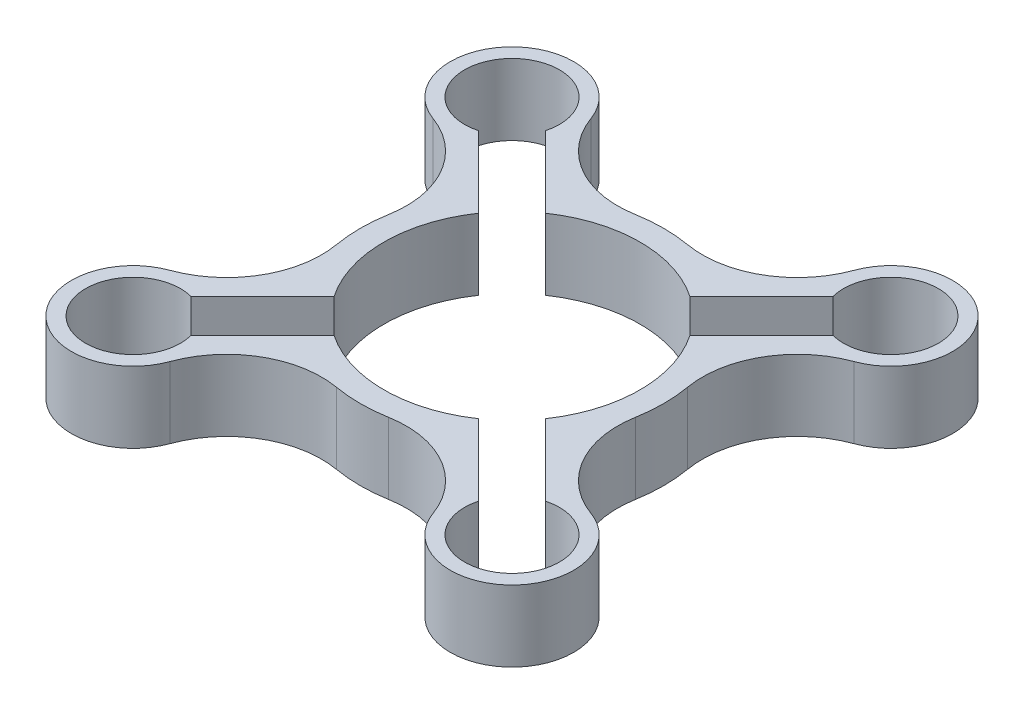
ISO-10303-21;
HEADER;
FILE_DESCRIPTION(('STEP AP214'),'2;1');
FILE_NAME('part.step','',(''),(''),'','','');
FILE_SCHEMA(('AUTOMOTIVE_DESIGN { 1 0 10303 214 1 1 1 1 }'));
ENDSEC;
DATA;
#1=APPLICATION_CONTEXT('core data for automotive mechanical design processes');
#2=APPLICATION_PROTOCOL_DEFINITION('international standard','automotive_design',2000,#1);
#3=PRODUCT_CONTEXT('',#1,'mechanical');
#4=PRODUCT('Part','Part','',(#3));
#5=PRODUCT_RELATED_PRODUCT_CATEGORY('part','',(#4));
#6=PRODUCT_DEFINITION_FORMATION('','',#4);
#7=PRODUCT_DEFINITION_CONTEXT('part definition',#1,'design');
#8=PRODUCT_DEFINITION('design','',#6,#7);
#9=PRODUCT_DEFINITION_SHAPE('','',#8);
#10=(LENGTH_UNIT() NAMED_UNIT(*) SI_UNIT(.MILLI.,.METRE.));
#11=(NAMED_UNIT(*) PLANE_ANGLE_UNIT() SI_UNIT($,.RADIAN.));
#12=(NAMED_UNIT(*) SI_UNIT($,.STERADIAN.) SOLID_ANGLE_UNIT());
#13=UNCERTAINTY_MEASURE_WITH_UNIT(LENGTH_MEASURE(1.E-05),#10,'distance_accuracy_value','');
#14=(GEOMETRIC_REPRESENTATION_CONTEXT(3) GLOBAL_UNCERTAINTY_ASSIGNED_CONTEXT((#13)) GLOBAL_UNIT_ASSIGNED_CONTEXT((#10,
#11,#12)) REPRESENTATION_CONTEXT('',''));
#15=CARTESIAN_POINT('',(0.,0.,0.));
#16=DIRECTION('',(0.,0.,1.));
#17=DIRECTION('',(1.,0.,0.));
#18=AXIS2_PLACEMENT_3D('',#15,#16,#17);
#19=CARTESIAN_POINT('',(0.,15.,0.));
#20=DIRECTION('',(0.,-1.,0.));
#21=DIRECTION('',(0.,0.,-1.));
#22=AXIS2_PLACEMENT_3D('',#19,#20,#21);
#23=CYLINDRICAL_SURFACE('',#22,27.);
#24=DIRECTION('',(0.,1.,0.));
#25=VECTOR('',#24,1.);
#26=CARTESIAN_POINT('',(22.2971969452275,0.,15.2261291333608));
#27=LINE('',#26,#25);
#28=CARTESIAN_POINT('',(22.2971969452275,0.,15.2261291333608));
#29=VERTEX_POINT('',#28);
#30=CARTESIAN_POINT('',(22.2971969452275,15.,15.2261291333608));
#31=VERTEX_POINT('',#30);
#32=EDGE_CURVE('E361',#29,#31,#27,.T.);
#33=ORIENTED_EDGE('',*,*,#32,.T.);
#34=CARTESIAN_POINT('',(0.,15.,0.));
#35=DIRECTION('',(0.,1.,0.));
#36=DIRECTION('',(0.,0.,1.));
#37=AXIS2_PLACEMENT_3D('',#34,#35,#36);
#38=CIRCLE('',#37,27.);
#39=CARTESIAN_POINT('',(22.2971969452264,15.,-15.226129133361));
#40=VERTEX_POINT('',#39);
#41=EDGE_CURVE('E414',#31,#40,#38,.T.);
#42=ORIENTED_EDGE('',*,*,#41,.T.);
#43=DIRECTION('',(0.,1.,0.));
#44=VECTOR('',#43,1.);
#45=CARTESIAN_POINT('',(22.2971969452264,0.,-15.226129133361));
#46=LINE('',#45,#44);
#47=CARTESIAN_POINT('',(22.2971969452264,0.,-15.226129133361));
#48=VERTEX_POINT('',#47);
#49=EDGE_CURVE('E268',#48,#40,#46,.T.);
#50=ORIENTED_EDGE('',*,*,#49,.F.);
#51=CARTESIAN_POINT('',(0.,0.,0.));
#52=DIRECTION('',(0.,1.,0.));
#53=DIRECTION('',(0.,0.,1.));
#54=AXIS2_PLACEMENT_3D('',#51,#52,#53);
#55=CIRCLE('',#54,27.);
#56=EDGE_CURVE('E284',#29,#48,#55,.T.);
#57=ORIENTED_EDGE('',*,*,#56,.F.);
#58=EDGE_LOOP('',(#33,#42,#50,#57));
#59=FACE_BOUND('',#58,.T.);
#60=ADVANCED_FACE('F46',(#59),#23,.F.);
#61=DIRECTION('',(0.,1.,0.));
#62=VECTOR('',#61,1.);
#63=CARTESIAN_POINT('',(15.2261291333619,0.,22.2971969452261));
#64=LINE('',#63,#62);
#65=CARTESIAN_POINT('',(15.2261291333617,0.,22.297196945226));
#66=VERTEX_POINT('',#65);
#67=CARTESIAN_POINT('',(15.2261291333619,15.,22.2971969452261));
#68=VERTEX_POINT('',#67);
#69=EDGE_CURVE('E372',#66,#68,#64,.T.);
#70=ORIENTED_EDGE('',*,*,#69,.F.);
#71=CARTESIAN_POINT('',(-15.226129133361,0.,22.2971969452265));
#72=VERTEX_POINT('',#71);
#73=EDGE_CURVE('E365',#72,#66,#55,.T.);
#74=ORIENTED_EDGE('',*,*,#73,.F.);
#75=DIRECTION('',(0.,1.,0.));
#76=VECTOR('',#75,1.);
#77=CARTESIAN_POINT('',(-15.226129133361,0.,22.2971969452265));
#78=LINE('',#77,#76);
#79=CARTESIAN_POINT('',(-15.226129133361,15.,22.2971969452265));
#80=VERTEX_POINT('',#79);
#81=EDGE_CURVE('E375',#72,#80,#78,.T.);
#82=ORIENTED_EDGE('',*,*,#81,.T.);
#83=EDGE_CURVE('E409',#80,#68,#38,.T.);
#84=ORIENTED_EDGE('',*,*,#83,.T.);
#85=EDGE_LOOP('',(#70,#74,#82,#84));
#86=FACE_BOUND('',#85,.T.);
#87=ADVANCED_FACE('F663',(#86),#23,.F.);
#88=DIRECTION('',(0.,1.,0.));
#89=VECTOR('',#88,1.);
#90=CARTESIAN_POINT('',(-22.2971969452261,0.,15.2261291333608));
#91=LINE('',#90,#89);
#92=CARTESIAN_POINT('',(-22.2971969452264,0.,15.226129133361));
#93=VERTEX_POINT('',#92);
#94=CARTESIAN_POINT('',(-22.2971969452261,15.,15.2261291333608));
#95=VERTEX_POINT('',#94);
#96=EDGE_CURVE('E385',#93,#95,#91,.T.);
#97=ORIENTED_EDGE('',*,*,#96,.F.);
#98=CARTESIAN_POINT('',(-22.2971969452263,0.,-15.2261291333599));
#99=VERTEX_POINT('',#98);
#100=EDGE_CURVE('E418',#99,#93,#55,.T.);
#101=ORIENTED_EDGE('',*,*,#100,.F.);
#102=DIRECTION('',(0.,1.,0.));
#103=VECTOR('',#102,1.);
#104=CARTESIAN_POINT('',(-22.2971969452263,0.,-15.2261291333599));
#105=LINE('',#104,#103);
#106=CARTESIAN_POINT('',(-22.2971969452263,15.,-15.2261291333599));
#107=VERTEX_POINT('',#106);
#108=EDGE_CURVE('E388',#99,#107,#105,.T.);
#109=ORIENTED_EDGE('',*,*,#108,.T.);
#110=EDGE_CURVE('E413',#107,#95,#38,.T.);
#111=ORIENTED_EDGE('',*,*,#110,.T.);
#112=EDGE_LOOP('',(#97,#101,#109,#111));
#113=FACE_BOUND('',#112,.T.);
#114=ADVANCED_FACE('F671',(#113),#23,.F.);
#115=CARTESIAN_POINT('',(24.4444242437382,15.,-45.5888706088684));
#116=DIRECTION('',(0.,1.,0.));
#117=DIRECTION('',(0.,0.,1.));
#118=AXIS2_PLACEMENT_3D('',#115,#116,#117);
#119=PLANE('',#118);
#120=DIRECTION('',(-0.707106781186548,0.,-0.707106781186547));
#121=VECTOR('',#120,1.);
#122=CARTESIAN_POINT('',(22.2971969452275,15.,15.2261291333608));
#123=LINE('',#122,#121);
#124=CARTESIAN_POINT('',(37.3633426860159,15.,30.2922748741495));
#125=VERTEX_POINT('',#124);
#126=EDGE_CURVE('E286',#125,#31,#123,.T.);
#127=ORIENTED_EDGE('',*,*,#126,.F.);
#128=CARTESIAN_POINT('',(39.9515331370399,15.,39.9515331370399));
#129=DIRECTION('',(0.,1.,0.));
#130=DIRECTION('',(0.,0.,1.));
#131=AXIS2_PLACEMENT_3D('',#128,#129,#130);
#132=CIRCLE('',#131,9.99999999999948);
#133=CARTESIAN_POINT('',(30.2922748741503,15.,37.3633426860145));
#134=VERTEX_POINT('',#133);
#135=EDGE_CURVE('E289',#134,#125,#132,.T.);
#136=ORIENTED_EDGE('',*,*,#135,.F.);
#137=DIRECTION('',(0.707106781186548,0.,0.707106781186547));
#138=VECTOR('',#137,1.);
#139=CARTESIAN_POINT('',(15.226129133362,15.,22.2971969452263));
#140=LINE('',#139,#138);
#141=EDGE_CURVE('E354',#68,#134,#140,.T.);
#142=ORIENTED_EDGE('',*,*,#141,.F.);
#143=ORIENTED_EDGE('',*,*,#83,.F.);
#144=DIRECTION('',(0.707106781186548,0.,-0.707106781186547));
#145=VECTOR('',#144,1.);
#146=CARTESIAN_POINT('',(-15.226129133361,15.,22.2971969452265));
#147=LINE('',#146,#145);
#148=CARTESIAN_POINT('',(-30.2922748741492,15.,37.3633426860147));
#149=VERTEX_POINT('',#148);
#150=EDGE_CURVE('E351',#149,#80,#147,.T.);
#151=ORIENTED_EDGE('',*,*,#150,.F.);
#152=CARTESIAN_POINT('',(-39.9515331370399,15.,39.9515331370399));
#153=DIRECTION('',(0.,1.,0.));
#154=DIRECTION('',(0.,0.,1.));
#155=AXIS2_PLACEMENT_3D('',#152,#153,#154);
#156=CIRCLE('',#155,10.);
#157=CARTESIAN_POINT('',(-37.3633426860147,15.,30.2922748741493));
#158=VERTEX_POINT('',#157);
#159=EDGE_CURVE('E347',#158,#149,#156,.T.);
#160=ORIENTED_EDGE('',*,*,#159,.F.);
#161=DIRECTION('',(-0.707106781186547,0.,0.707106781186548));
#162=VECTOR('',#161,1.);
#163=CARTESIAN_POINT('',(-22.2971969452264,15.,15.226129133361));
#164=LINE('',#163,#162);
#165=EDGE_CURVE('E343',#95,#158,#164,.T.);
#166=ORIENTED_EDGE('',*,*,#165,.F.);
#167=ORIENTED_EDGE('',*,*,#110,.F.);
#168=DIRECTION('',(0.707106781186548,0.,0.707106781186547));
#169=VECTOR('',#168,1.);
#170=CARTESIAN_POINT('',(-22.2971969452263,15.,-15.2261291333599));
#171=LINE('',#170,#169);
#172=CARTESIAN_POINT('',(-37.3633426860146,15.,-30.2922748741485));
#173=VERTEX_POINT('',#172);
#174=EDGE_CURVE('E340',#173,#107,#171,.T.);
#175=ORIENTED_EDGE('',*,*,#174,.F.);
#176=CARTESIAN_POINT('',(-39.9515331370399,15.,-39.9515331370399));
#177=DIRECTION('',(0.,1.,0.));
#178=DIRECTION('',(0.,0.,1.));
#179=AXIS2_PLACEMENT_3D('',#176,#177,#178);
#180=CIRCLE('',#179,10.0000000000008);
#181=CARTESIAN_POINT('',(-30.2922748741491,15.,-37.3633426860137));
#182=VERTEX_POINT('',#181);
#183=EDGE_CURVE('E336',#182,#173,#180,.T.);
#184=ORIENTED_EDGE('',*,*,#183,.F.);
#185=DIRECTION('',(-0.707106781186548,0.,-0.707106781186547));
#186=VECTOR('',#185,1.);
#187=CARTESIAN_POINT('',(-15.2261291333608,15.,-22.2971969452254));
#188=LINE('',#187,#186);
#189=CARTESIAN_POINT('',(-15.2261291333611,15.,-22.2971969452258));
#190=VERTEX_POINT('',#189);
#191=EDGE_CURVE('E332',#190,#182,#188,.T.);
#192=ORIENTED_EDGE('',*,*,#191,.F.);
#193=CARTESIAN_POINT('',(15.226129133361,15.,-22.2971969452265));
#194=VERTEX_POINT('',#193);
#195=EDGE_CURVE('E705',#194,#190,#38,.T.);
#196=ORIENTED_EDGE('',*,*,#195,.F.);
#197=DIRECTION('',(-0.707106781186547,0.,0.707106781186548));
#198=VECTOR('',#197,1.);
#199=CARTESIAN_POINT('',(15.226129133361,15.,-22.2971969452265));
#200=LINE('',#199,#198);
#201=CARTESIAN_POINT('',(30.2922748741492,15.,-37.3633426860147));
#202=VERTEX_POINT('',#201);
#203=EDGE_CURVE('E329',#202,#194,#200,.T.);
#204=ORIENTED_EDGE('',*,*,#203,.F.);
#205=CARTESIAN_POINT('',(39.9515331370399,15.,-39.9515331370399));
#206=DIRECTION('',(0.,1.,0.));
#207=DIRECTION('',(0.,0.,1.));
#208=AXIS2_PLACEMENT_3D('',#205,#206,#207);
#209=CIRCLE('',#208,10.);
#210=CARTESIAN_POINT('',(37.3633426860147,15.,-30.2922748741493));
#211=VERTEX_POINT('',#210);
#212=EDGE_CURVE('E326',#211,#202,#209,.T.);
#213=ORIENTED_EDGE('',*,*,#212,.F.);
#214=DIRECTION('',(0.707106781186547,0.,-0.707106781186548));
#215=VECTOR('',#214,1.);
#216=CARTESIAN_POINT('',(22.2971969452264,15.,-15.226129133361));
#217=LINE('',#216,#215);
#218=EDGE_CURVE('E262',#40,#211,#217,.T.);
#219=ORIENTED_EDGE('',*,*,#218,.F.);
#220=ORIENTED_EDGE('',*,*,#41,.F.);
#221=EDGE_LOOP('',(#127,#136,#142,#143,#151,#160,#166,#167,#175,#184,#192,#196,#204,#213,#219,#220));
#222=FACE_BOUND('',#221,.T.);
#223=CARTESIAN_POINT('',(8.93731535043641,15.,-51.2262080806969));
#224=DIRECTION('',(0.,-1.,0.));
#225=DIRECTION('',(0.,0.,1.));
#226=AXIS2_PLACEMENT_3D('',#223,#224,#225);
#227=CIRCLE('',#226,20.);
#228=CARTESIAN_POINT('',(27.733810978681,15.,-44.3930717512078));
#229=VERTEX_POINT('',#228);
#230=CARTESIAN_POINT('',(5.49988636949932,15.,-31.5238203573519));
#231=VERTEX_POINT('',#230);
#232=EDGE_CURVE('E419',#229,#231,#227,.T.);
#233=ORIENTED_EDGE('',*,*,#232,.T.);
#234=CARTESIAN_POINT('',(0.,15.,0.));
#235=DIRECTION('',(0.,1.,0.));
#236=DIRECTION('',(0.,0.,1.));
#237=AXIS2_PLACEMENT_3D('',#234,#235,#236);
#238=CIRCLE('',#237,32.);
#239=CARTESIAN_POINT('',(-5.49988636949933,15.,-31.5238203573519));
#240=VERTEX_POINT('',#239);
#241=EDGE_CURVE('E423',#231,#240,#238,.T.);
#242=ORIENTED_EDGE('',*,*,#241,.T.);
#243=CARTESIAN_POINT('',(-8.93731535043641,15.,-51.2262080806969));
#244=DIRECTION('',(0.,-1.,0.));
#245=DIRECTION('',(0.,0.,-1.));
#246=AXIS2_PLACEMENT_3D('',#243,#244,#245);
#247=CIRCLE('',#246,20.);
#248=CARTESIAN_POINT('',(-27.733810978681,15.,-44.3930717512078));
#249=VERTEX_POINT('',#248);
#250=EDGE_CURVE('E427',#240,#249,#247,.T.);
#251=ORIENTED_EDGE('',*,*,#250,.T.);
#252=CARTESIAN_POINT('',(-39.9515331370399,15.,-39.9515331370399));
#253=DIRECTION('',(0.,1.,0.));
#254=DIRECTION('',(0.,0.,1.));
#255=AXIS2_PLACEMENT_3D('',#252,#253,#254);
#256=CIRCLE('',#255,13.);
#257=CARTESIAN_POINT('',(-44.3930717512078,15.,-27.733810978681));
#258=VERTEX_POINT('',#257);
#259=EDGE_CURVE('E430',#249,#258,#256,.T.);
#260=ORIENTED_EDGE('',*,*,#259,.T.);
#261=CARTESIAN_POINT('',(-51.2262080806969,15.,-8.93731535043642));
#262=DIRECTION('',(0.,-1.,0.));
#263=DIRECTION('',(0.,0.,1.));
#264=AXIS2_PLACEMENT_3D('',#261,#262,#263);
#265=CIRCLE('',#264,20.);
#266=CARTESIAN_POINT('',(-31.5238203573519,15.,-5.49988636949932));
#267=VERTEX_POINT('',#266);
#268=EDGE_CURVE('E433',#258,#267,#265,.T.);
#269=ORIENTED_EDGE('',*,*,#268,.T.);
#270=CARTESIAN_POINT('',(0.,15.,0.));
#271=DIRECTION('',(0.,1.,0.));
#272=DIRECTION('',(0.,0.,1.));
#273=AXIS2_PLACEMENT_3D('',#270,#271,#272);
#274=CIRCLE('',#273,32.);
#275=CARTESIAN_POINT('',(-31.5238203573519,15.,5.49988636949933));
#276=VERTEX_POINT('',#275);
#277=EDGE_CURVE('E436',#267,#276,#274,.T.);
#278=ORIENTED_EDGE('',*,*,#277,.T.);
#279=CARTESIAN_POINT('',(-51.2262080806969,15.,8.93731535043641));
#280=DIRECTION('',(0.,-1.,0.));
#281=DIRECTION('',(0.,0.,-1.));
#282=AXIS2_PLACEMENT_3D('',#279,#280,#281);
#283=CIRCLE('',#282,20.);
#284=CARTESIAN_POINT('',(-44.3930717512078,15.,27.733810978681));
#285=VERTEX_POINT('',#284);
#286=EDGE_CURVE('E439',#276,#285,#283,.T.);
#287=ORIENTED_EDGE('',*,*,#286,.T.);
#288=CARTESIAN_POINT('',(-39.9515331370399,15.,39.9515331370399));
#289=DIRECTION('',(0.,1.,0.));
#290=DIRECTION('',(0.,0.,1.));
#291=AXIS2_PLACEMENT_3D('',#288,#289,#290);
#292=CIRCLE('',#291,13.);
#293=CARTESIAN_POINT('',(-27.733810978681,15.,44.3930717512078));
#294=VERTEX_POINT('',#293);
#295=EDGE_CURVE('E442',#285,#294,#292,.T.);
#296=ORIENTED_EDGE('',*,*,#295,.T.);
#297=CARTESIAN_POINT('',(-8.9373153504364,15.,51.2262080806969));
#298=DIRECTION('',(0.,-1.,0.));
#299=DIRECTION('',(0.,0.,1.));
#300=AXIS2_PLACEMENT_3D('',#297,#298,#299);
#301=CIRCLE('',#300,20.);
#302=CARTESIAN_POINT('',(-5.49988636949932,15.,31.5238203573519));
#303=VERTEX_POINT('',#302);
#304=EDGE_CURVE('E445',#294,#303,#301,.T.);
#305=ORIENTED_EDGE('',*,*,#304,.T.);
#306=CARTESIAN_POINT('',(0.,15.,0.));
#307=DIRECTION('',(0.,1.,0.));
#308=DIRECTION('',(0.,0.,1.));
#309=AXIS2_PLACEMENT_3D('',#306,#307,#308);
#310=CIRCLE('',#309,32.);
#311=CARTESIAN_POINT('',(5.49988636949932,15.,31.5238203573519));
#312=VERTEX_POINT('',#311);
#313=EDGE_CURVE('E448',#303,#312,#310,.T.);
#314=ORIENTED_EDGE('',*,*,#313,.T.);
#315=CARTESIAN_POINT('',(8.93731535043641,15.,51.2262080806969));
#316=DIRECTION('',(0.,-1.,0.));
#317=DIRECTION('',(0.,0.,-1.));
#318=AXIS2_PLACEMENT_3D('',#315,#316,#317);
#319=CIRCLE('',#318,20.);
#320=CARTESIAN_POINT('',(27.733810978681,15.,44.3930717512078));
#321=VERTEX_POINT('',#320);
#322=EDGE_CURVE('E451',#312,#321,#319,.T.);
#323=ORIENTED_EDGE('',*,*,#322,.T.);
#324=CARTESIAN_POINT('',(39.9515331370399,15.,39.9515331370399));
#325=DIRECTION('',(0.,1.,0.));
#326=DIRECTION('',(0.,0.,1.));
#327=AXIS2_PLACEMENT_3D('',#324,#325,#326);
#328=CIRCLE('',#327,13.);
#329=CARTESIAN_POINT('',(44.3930717512078,15.,27.733810978681));
#330=VERTEX_POINT('',#329);
#331=EDGE_CURVE('E454',#321,#330,#328,.T.);
#332=ORIENTED_EDGE('',*,*,#331,.T.);
#333=CARTESIAN_POINT('',(51.2262080806969,15.,8.93731535043641));
#334=DIRECTION('',(0.,-1.,0.));
#335=DIRECTION('',(0.,0.,1.));
#336=AXIS2_PLACEMENT_3D('',#333,#334,#335);
#337=CIRCLE('',#336,20.);
#338=CARTESIAN_POINT('',(31.5238203573519,15.,5.49988636949933));
#339=VERTEX_POINT('',#338);
#340=EDGE_CURVE('E457',#330,#339,#337,.T.);
#341=ORIENTED_EDGE('',*,*,#340,.T.);
#342=CARTESIAN_POINT('',(0.,15.,0.));
#343=DIRECTION('',(0.,1.,0.));
#344=DIRECTION('',(0.,0.,1.));
#345=AXIS2_PLACEMENT_3D('',#342,#343,#344);
#346=CIRCLE('',#345,32.);
#347=CARTESIAN_POINT('',(31.5238203573519,15.,-5.49988636949933));
#348=VERTEX_POINT('',#347);
#349=EDGE_CURVE('E460',#339,#348,#346,.T.);
#350=ORIENTED_EDGE('',*,*,#349,.T.);
#351=CARTESIAN_POINT('',(51.2262080806969,15.,-8.93731535043642));
#352=DIRECTION('',(0.,-1.,0.));
#353=DIRECTION('',(0.,0.,-1.));
#354=AXIS2_PLACEMENT_3D('',#351,#352,#353);
#355=CIRCLE('',#354,20.);
#356=CARTESIAN_POINT('',(44.3930717512078,15.,-27.733810978681));
#357=VERTEX_POINT('',#356);
#358=EDGE_CURVE('E463',#348,#357,#355,.T.);
#359=ORIENTED_EDGE('',*,*,#358,.T.);
#360=CARTESIAN_POINT('',(39.9515331370399,15.,-39.9515331370399));
#361=DIRECTION('',(0.,1.,0.));
#362=DIRECTION('',(0.,0.,1.));
#363=AXIS2_PLACEMENT_3D('',#360,#361,#362);
#364=CIRCLE('',#363,13.);
#365=EDGE_CURVE('E466',#357,#229,#364,.T.);
#366=ORIENTED_EDGE('',*,*,#365,.T.);
#367=EDGE_LOOP('',(#233,#242,#251,#260,#269,#278,#287,#296,#305,#314,#323,#332,#341,#350,#359,#366));
#368=FACE_BOUND('',#367,.T.);
#369=ADVANCED_FACE('F596',(#222,#368),#119,.T.);
#370=CARTESIAN_POINT('',(24.4444242437382,0.,-45.5888706088684));
#371=DIRECTION('',(0.,1.,0.));
#372=DIRECTION('',(0.,0.,1.));
#373=AXIS2_PLACEMENT_3D('',#370,#371,#372);
#374=PLANE('',#373);
#375=CARTESIAN_POINT('',(8.93731535043641,0.,-51.2262080806969));
#376=DIRECTION('',(0.,-1.,0.));
#377=DIRECTION('',(0.,0.,1.));
#378=AXIS2_PLACEMENT_3D('',#375,#376,#377);
#379=CIRCLE('',#378,20.);
#380=CARTESIAN_POINT('',(27.733810978681,0.,-44.3930717512078));
#381=VERTEX_POINT('',#380);
#382=CARTESIAN_POINT('',(5.49988636949932,0.,-31.5238203573519));
#383=VERTEX_POINT('',#382);
#384=EDGE_CURVE('E470',#381,#383,#379,.T.);
#385=ORIENTED_EDGE('',*,*,#384,.F.);
#386=CARTESIAN_POINT('',(39.9515331370399,0.,-39.9515331370399));
#387=DIRECTION('',(0.,1.,0.));
#388=DIRECTION('',(0.,0.,1.));
#389=AXIS2_PLACEMENT_3D('',#386,#387,#388);
#390=CIRCLE('',#389,13.);
#391=CARTESIAN_POINT('',(44.3930717512078,0.,-27.733810978681));
#392=VERTEX_POINT('',#391);
#393=EDGE_CURVE('E424',#392,#381,#390,.T.);
#394=ORIENTED_EDGE('',*,*,#393,.F.);
#395=CARTESIAN_POINT('',(51.2262080806969,0.,-8.93731535043642));
#396=DIRECTION('',(0.,-1.,0.));
#397=DIRECTION('',(0.,0.,-1.));
#398=AXIS2_PLACEMENT_3D('',#395,#396,#397);
#399=CIRCLE('',#398,20.);
#400=CARTESIAN_POINT('',(31.5238203573519,0.,-5.49988636949933));
#401=VERTEX_POINT('',#400);
#402=EDGE_CURVE('E513',#401,#392,#399,.T.);
#403=ORIENTED_EDGE('',*,*,#402,.F.);
#404=CARTESIAN_POINT('',(0.,0.,0.));
#405=DIRECTION('',(0.,1.,0.));
#406=DIRECTION('',(0.,0.,1.));
#407=AXIS2_PLACEMENT_3D('',#404,#405,#406);
#408=CIRCLE('',#407,32.);
#409=CARTESIAN_POINT('',(31.5238203573519,0.,5.49988636949933));
#410=VERTEX_POINT('',#409);
#411=EDGE_CURVE('E510',#410,#401,#408,.T.);
#412=ORIENTED_EDGE('',*,*,#411,.F.);
#413=CARTESIAN_POINT('',(51.2262080806969,0.,8.93731535043641));
#414=DIRECTION('',(0.,-1.,0.));
#415=DIRECTION('',(0.,0.,1.));
#416=AXIS2_PLACEMENT_3D('',#413,#414,#415);
#417=CIRCLE('',#416,20.);
#418=CARTESIAN_POINT('',(44.3930717512078,0.,27.733810978681));
#419=VERTEX_POINT('',#418);
#420=EDGE_CURVE('E507',#419,#410,#417,.T.);
#421=ORIENTED_EDGE('',*,*,#420,.F.);
#422=CARTESIAN_POINT('',(39.9515331370399,0.,39.9515331370399));
#423=DIRECTION('',(0.,1.,0.));
#424=DIRECTION('',(0.,0.,1.));
#425=AXIS2_PLACEMENT_3D('',#422,#423,#424);
#426=CIRCLE('',#425,13.);
#427=CARTESIAN_POINT('',(27.733810978681,0.,44.3930717512078));
#428=VERTEX_POINT('',#427);
#429=EDGE_CURVE('E504',#428,#419,#426,.T.);
#430=ORIENTED_EDGE('',*,*,#429,.F.);
#431=CARTESIAN_POINT('',(8.93731535043641,0.,51.2262080806969));
#432=DIRECTION('',(0.,-1.,0.));
#433=DIRECTION('',(0.,0.,-1.));
#434=AXIS2_PLACEMENT_3D('',#431,#432,#433);
#435=CIRCLE('',#434,20.);
#436=CARTESIAN_POINT('',(5.49988636949932,0.,31.5238203573519));
#437=VERTEX_POINT('',#436);
#438=EDGE_CURVE('E501',#437,#428,#435,.T.);
#439=ORIENTED_EDGE('',*,*,#438,.F.);
#440=CARTESIAN_POINT('',(0.,0.,0.));
#441=DIRECTION('',(0.,1.,0.));
#442=DIRECTION('',(0.,0.,1.));
#443=AXIS2_PLACEMENT_3D('',#440,#441,#442);
#444=CIRCLE('',#443,32.);
#445=CARTESIAN_POINT('',(-5.49988636949932,0.,31.5238203573519));
#446=VERTEX_POINT('',#445);
#447=EDGE_CURVE('E498',#446,#437,#444,.T.);
#448=ORIENTED_EDGE('',*,*,#447,.F.);
#449=CARTESIAN_POINT('',(-8.9373153504364,0.,51.2262080806969));
#450=DIRECTION('',(0.,-1.,0.));
#451=DIRECTION('',(0.,0.,1.));
#452=AXIS2_PLACEMENT_3D('',#449,#450,#451);
#453=CIRCLE('',#452,20.);
#454=CARTESIAN_POINT('',(-27.733810978681,0.,44.3930717512078));
#455=VERTEX_POINT('',#454);
#456=EDGE_CURVE('E495',#455,#446,#453,.T.);
#457=ORIENTED_EDGE('',*,*,#456,.F.);
#458=CARTESIAN_POINT('',(-39.9515331370399,0.,39.9515331370399));
#459=DIRECTION('',(0.,1.,0.));
#460=DIRECTION('',(0.,0.,1.));
#461=AXIS2_PLACEMENT_3D('',#458,#459,#460);
#462=CIRCLE('',#461,13.);
#463=CARTESIAN_POINT('',(-44.3930717512078,0.,27.733810978681));
#464=VERTEX_POINT('',#463);
#465=EDGE_CURVE('E492',#464,#455,#462,.T.);
#466=ORIENTED_EDGE('',*,*,#465,.F.);
#467=CARTESIAN_POINT('',(-51.2262080806969,0.,8.93731535043641));
#468=DIRECTION('',(0.,-1.,0.));
#469=DIRECTION('',(0.,0.,-1.));
#470=AXIS2_PLACEMENT_3D('',#467,#468,#469);
#471=CIRCLE('',#470,20.);
#472=CARTESIAN_POINT('',(-31.5238203573519,0.,5.49988636949933));
#473=VERTEX_POINT('',#472);
#474=EDGE_CURVE('E489',#473,#464,#471,.T.);
#475=ORIENTED_EDGE('',*,*,#474,.F.);
#476=CARTESIAN_POINT('',(0.,0.,0.));
#477=DIRECTION('',(0.,1.,0.));
#478=DIRECTION('',(0.,0.,1.));
#479=AXIS2_PLACEMENT_3D('',#476,#477,#478);
#480=CIRCLE('',#479,32.);
#481=CARTESIAN_POINT('',(-31.5238203573519,0.,-5.49988636949932));
#482=VERTEX_POINT('',#481);
#483=EDGE_CURVE('E486',#482,#473,#480,.T.);
#484=ORIENTED_EDGE('',*,*,#483,.F.);
#485=CARTESIAN_POINT('',(-51.2262080806969,0.,-8.93731535043642));
#486=DIRECTION('',(0.,-1.,0.));
#487=DIRECTION('',(0.,0.,1.));
#488=AXIS2_PLACEMENT_3D('',#485,#486,#487);
#489=CIRCLE('',#488,20.);
#490=CARTESIAN_POINT('',(-44.3930717512078,0.,-27.733810978681));
#491=VERTEX_POINT('',#490);
#492=EDGE_CURVE('E483',#491,#482,#489,.T.);
#493=ORIENTED_EDGE('',*,*,#492,.F.);
#494=CARTESIAN_POINT('',(-39.9515331370399,0.,-39.9515331370399));
#495=DIRECTION('',(0.,1.,0.));
#496=DIRECTION('',(0.,0.,1.));
#497=AXIS2_PLACEMENT_3D('',#494,#495,#496);
#498=CIRCLE('',#497,13.);
#499=CARTESIAN_POINT('',(-27.733810978681,0.,-44.3930717512078));
#500=VERTEX_POINT('',#499);
#501=EDGE_CURVE('E480',#500,#491,#498,.T.);
#502=ORIENTED_EDGE('',*,*,#501,.F.);
#503=CARTESIAN_POINT('',(-8.93731535043641,0.,-51.2262080806969));
#504=DIRECTION('',(0.,-1.,0.));
#505=DIRECTION('',(0.,0.,-1.));
#506=AXIS2_PLACEMENT_3D('',#503,#504,#505);
#507=CIRCLE('',#506,20.);
#508=CARTESIAN_POINT('',(-5.49988636949933,0.,-31.5238203573519));
#509=VERTEX_POINT('',#508);
#510=EDGE_CURVE('E477',#509,#500,#507,.T.);
#511=ORIENTED_EDGE('',*,*,#510,.F.);
#512=CARTESIAN_POINT('',(0.,0.,0.));
#513=DIRECTION('',(0.,1.,0.));
#514=DIRECTION('',(0.,0.,1.));
#515=AXIS2_PLACEMENT_3D('',#512,#513,#514);
#516=CIRCLE('',#515,32.);
#517=EDGE_CURVE('E474',#383,#509,#516,.T.);
#518=ORIENTED_EDGE('',*,*,#517,.F.);
#519=EDGE_LOOP('',(#385,#394,#403,#412,#421,#430,#439,#448,#457,#466,#475,#484,#493,#502,#511,#518));
#520=FACE_BOUND('',#519,.T.);
#521=CARTESIAN_POINT('',(39.9515331370399,0.,39.9515331370399));
#522=DIRECTION('',(0.,1.,0.));
#523=DIRECTION('',(0.,0.,1.));
#524=AXIS2_PLACEMENT_3D('',#521,#522,#523);
#525=CIRCLE('',#524,9.99999999999948);
#526=CARTESIAN_POINT('',(30.2922748741503,0.,37.3633426860145));
#527=VERTEX_POINT('',#526);
#528=CARTESIAN_POINT('',(37.3633426860159,0.,30.2922748741495));
#529=VERTEX_POINT('',#528);
#530=EDGE_CURVE('E318',#527,#529,#525,.T.);
#531=ORIENTED_EDGE('',*,*,#530,.T.);
#532=DIRECTION('',(-0.707106781186548,0.,-0.707106781186547));
#533=VECTOR('',#532,1.);
#534=CARTESIAN_POINT('',(22.2971969452275,0.,15.2261291333608));
#535=LINE('',#534,#533);
#536=EDGE_CURVE('E321',#529,#29,#535,.T.);
#537=ORIENTED_EDGE('',*,*,#536,.T.);
#538=ORIENTED_EDGE('',*,*,#56,.T.);
#539=DIRECTION('',(0.707106781186547,0.,-0.707106781186548));
#540=VECTOR('',#539,1.);
#541=CARTESIAN_POINT('',(22.2971969452264,0.,-15.226129133361));
#542=LINE('',#541,#540);
#543=CARTESIAN_POINT('',(37.3633426860147,0.,-30.2922748741493));
#544=VERTEX_POINT('',#543);
#545=EDGE_CURVE('E259',#48,#544,#542,.T.);
#546=ORIENTED_EDGE('',*,*,#545,.T.);
#547=CARTESIAN_POINT('',(39.9515331370399,0.,-39.9515331370399));
#548=DIRECTION('',(0.,1.,0.));
#549=DIRECTION('',(0.,0.,1.));
#550=AXIS2_PLACEMENT_3D('',#547,#548,#549);
#551=CIRCLE('',#550,10.);
#552=CARTESIAN_POINT('',(30.2922748741492,0.,-37.3633426860147));
#553=VERTEX_POINT('',#552);
#554=EDGE_CURVE('E271',#544,#553,#551,.T.);
#555=ORIENTED_EDGE('',*,*,#554,.T.);
#556=DIRECTION('',(-0.707106781186547,0.,0.707106781186548));
#557=VECTOR('',#556,1.);
#558=CARTESIAN_POINT('',(15.226129133361,0.,-22.2971969452265));
#559=LINE('',#558,#557);
#560=CARTESIAN_POINT('',(15.226129133361,0.,-22.2971969452265));
#561=VERTEX_POINT('',#560);
#562=EDGE_CURVE('E277',#553,#561,#559,.T.);
#563=ORIENTED_EDGE('',*,*,#562,.T.);
#564=CARTESIAN_POINT('',(-15.2261291333613,0.,-22.2971969452262));
#565=VERTEX_POINT('',#564);
#566=EDGE_CURVE('E698',#561,#565,#55,.T.);
#567=ORIENTED_EDGE('',*,*,#566,.T.);
#568=DIRECTION('',(-0.707106781186548,0.,-0.707106781186547));
#569=VECTOR('',#568,1.);
#570=CARTESIAN_POINT('',(-15.2261291333608,0.,-22.2971969452254));
#571=LINE('',#570,#569);
#572=CARTESIAN_POINT('',(-30.2922748741491,0.,-37.3633426860137));
#573=VERTEX_POINT('',#572);
#574=EDGE_CURVE('E70',#565,#573,#571,.T.);
#575=ORIENTED_EDGE('',*,*,#574,.T.);
#576=CARTESIAN_POINT('',(-39.9515331370399,0.,-39.9515331370399));
#577=DIRECTION('',(0.,1.,0.));
#578=DIRECTION('',(0.,0.,1.));
#579=AXIS2_PLACEMENT_3D('',#576,#577,#578);
#580=CIRCLE('',#579,10.0000000000008);
#581=CARTESIAN_POINT('',(-37.3633426860146,0.,-30.2922748741485));
#582=VERTEX_POINT('',#581);
#583=EDGE_CURVE('E296',#573,#582,#580,.T.);
#584=ORIENTED_EDGE('',*,*,#583,.T.);
#585=DIRECTION('',(0.707106781186548,0.,0.707106781186547));
#586=VECTOR('',#585,1.);
#587=CARTESIAN_POINT('',(-22.2971969452263,0.,-15.2261291333599));
#588=LINE('',#587,#586);
#589=EDGE_CURVE('E300',#582,#99,#588,.T.);
#590=ORIENTED_EDGE('',*,*,#589,.T.);
#591=ORIENTED_EDGE('',*,*,#100,.T.);
#592=DIRECTION('',(-0.707106781186547,0.,0.707106781186548));
#593=VECTOR('',#592,1.);
#594=CARTESIAN_POINT('',(-22.2971969452264,0.,15.226129133361));
#595=LINE('',#594,#593);
#596=CARTESIAN_POINT('',(-37.3633426860147,0.,30.2922748741493));
#597=VERTEX_POINT('',#596);
#598=EDGE_CURVE('E62',#93,#597,#595,.T.);
#599=ORIENTED_EDGE('',*,*,#598,.T.);
#600=CARTESIAN_POINT('',(-39.9515331370399,0.,39.9515331370399));
#601=DIRECTION('',(0.,1.,0.));
#602=DIRECTION('',(0.,0.,1.));
#603=AXIS2_PLACEMENT_3D('',#600,#601,#602);
#604=CIRCLE('',#603,10.);
#605=CARTESIAN_POINT('',(-30.2922748741492,0.,37.3633426860147));
#606=VERTEX_POINT('',#605);
#607=EDGE_CURVE('E306',#597,#606,#604,.T.);
#608=ORIENTED_EDGE('',*,*,#607,.T.);
#609=DIRECTION('',(0.707106781186548,0.,-0.707106781186547));
#610=VECTOR('',#609,1.);
#611=CARTESIAN_POINT('',(-15.226129133361,0.,22.2971969452265));
#612=LINE('',#611,#610);
#613=EDGE_CURVE('E310',#606,#72,#612,.T.);
#614=ORIENTED_EDGE('',*,*,#613,.T.);
#615=ORIENTED_EDGE('',*,*,#73,.T.);
#616=DIRECTION('',(0.707106781186548,0.,0.707106781186547));
#617=VECTOR('',#616,1.);
#618=CARTESIAN_POINT('',(15.226129133362,0.,22.2971969452263));
#619=LINE('',#618,#617);
#620=EDGE_CURVE('E314',#66,#527,#619,.T.);
#621=ORIENTED_EDGE('',*,*,#620,.T.);
#622=EDGE_LOOP('',(#531,#537,#538,#546,#555,#563,#567,#575,#584,#590,#591,#599,#608,#614,#615,#621));
#623=FACE_BOUND('',#622,.T.);
#624=ADVANCED_FACE('F281',(#520,#623),#374,.F.);
#625=CARTESIAN_POINT('',(8.93731535043641,15.,-51.2262080806969));
#626=DIRECTION('',(0.,-1.,0.));
#627=DIRECTION('',(0.,0.,-1.));
#628=AXIS2_PLACEMENT_3D('',#625,#626,#627);
#629=CYLINDRICAL_SURFACE('',#628,20.);
#630=ORIENTED_EDGE('',*,*,#384,.T.);
#631=DIRECTION('',(0.,-1.,0.));
#632=VECTOR('',#631,1.);
#633=CARTESIAN_POINT('',(5.49988636949932,15.,-31.5238203573519));
#634=LINE('',#633,#632);
#635=EDGE_CURVE('E12',#231,#383,#634,.T.);
#636=ORIENTED_EDGE('',*,*,#635,.F.);
#637=ORIENTED_EDGE('',*,*,#232,.F.);
#638=DIRECTION('',(0.,-1.,0.));
#639=VECTOR('',#638,1.);
#640=CARTESIAN_POINT('',(27.733810978681,15.,-44.3930717512078));
#641=LINE('',#640,#639);
#642=EDGE_CURVE('E469',#229,#381,#641,.T.);
#643=ORIENTED_EDGE('',*,*,#642,.T.);
#644=EDGE_LOOP('',(#630,#636,#637,#643));
#645=FACE_BOUND('',#644,.T.);
#646=ADVANCED_FACE('F48',(#645),#629,.F.);
#647=CARTESIAN_POINT('',(0.,15.,0.));
#648=DIRECTION('',(0.,-1.,0.));
#649=DIRECTION('',(0.,0.,-1.));
#650=AXIS2_PLACEMENT_3D('',#647,#648,#649);
#651=CYLINDRICAL_SURFACE('',#650,32.);
#652=ORIENTED_EDGE('',*,*,#517,.T.);
#653=DIRECTION('',(0.,-1.,0.));
#654=VECTOR('',#653,1.);
#655=CARTESIAN_POINT('',(-5.49988636949933,15.,-31.5238203573519));
#656=LINE('',#655,#654);
#657=EDGE_CURVE('E55',#240,#509,#656,.T.);
#658=ORIENTED_EDGE('',*,*,#657,.F.);
#659=ORIENTED_EDGE('',*,*,#241,.F.);
#660=ORIENTED_EDGE('',*,*,#635,.T.);
#661=EDGE_LOOP('',(#652,#658,#659,#660));
#662=FACE_BOUND('',#661,.T.);
#663=ADVANCED_FACE('F600',(#662),#651,.T.);
#664=CARTESIAN_POINT('',(-8.93731535043641,15.,-51.2262080806969));
#665=DIRECTION('',(0.,-1.,0.));
#666=DIRECTION('',(0.,0.,-1.));
#667=AXIS2_PLACEMENT_3D('',#664,#665,#666);
#668=CYLINDRICAL_SURFACE('',#667,20.);
#669=ORIENTED_EDGE('',*,*,#510,.T.);
#670=DIRECTION('',(0.,-1.,0.));
#671=VECTOR('',#670,1.);
#672=CARTESIAN_POINT('',(-27.733810978681,15.,-44.3930717512078));
#673=LINE('',#672,#671);
#674=EDGE_CURVE('E569',#249,#500,#673,.T.);
#675=ORIENTED_EDGE('',*,*,#674,.F.);
#676=ORIENTED_EDGE('',*,*,#250,.F.);
#677=ORIENTED_EDGE('',*,*,#657,.T.);
#678=EDGE_LOOP('',(#669,#675,#676,#677));
#679=FACE_BOUND('',#678,.T.);
#680=ADVANCED_FACE('F578',(#679),#668,.F.);
#681=CARTESIAN_POINT('',(-39.9515331370399,15.,-39.9515331370399));
#682=DIRECTION('',(0.,-1.,0.));
#683=DIRECTION('',(0.,0.,-1.));
#684=AXIS2_PLACEMENT_3D('',#681,#682,#683);
#685=CYLINDRICAL_SURFACE('',#684,13.);
#686=ORIENTED_EDGE('',*,*,#501,.T.);
#687=DIRECTION('',(0.,-1.,0.));
#688=VECTOR('',#687,1.);
#689=CARTESIAN_POINT('',(-44.3930717512078,15.,-27.733810978681));
#690=LINE('',#689,#688);
#691=EDGE_CURVE('E565',#258,#491,#690,.T.);
#692=ORIENTED_EDGE('',*,*,#691,.F.);
#693=ORIENTED_EDGE('',*,*,#259,.F.);
#694=ORIENTED_EDGE('',*,*,#674,.T.);
#695=EDGE_LOOP('',(#686,#692,#693,#694));
#696=FACE_BOUND('',#695,.T.);
#697=ADVANCED_FACE('F588',(#696),#685,.T.);
#698=CARTESIAN_POINT('',(-51.2262080806969,15.,-8.93731535043642));
#699=DIRECTION('',(0.,-1.,0.));
#700=DIRECTION('',(0.,0.,-1.));
#701=AXIS2_PLACEMENT_3D('',#698,#699,#700);
#702=CYLINDRICAL_SURFACE('',#701,20.);
#703=ORIENTED_EDGE('',*,*,#492,.T.);
#704=DIRECTION('',(0.,-1.,0.));
#705=VECTOR('',#704,1.);
#706=CARTESIAN_POINT('',(-31.5238203573519,15.,-5.49988636949932));
#707=LINE('',#706,#705);
#708=EDGE_CURVE('E561',#267,#482,#707,.T.);
#709=ORIENTED_EDGE('',*,*,#708,.F.);
#710=ORIENTED_EDGE('',*,*,#268,.F.);
#711=ORIENTED_EDGE('',*,*,#691,.T.);
#712=EDGE_LOOP('',(#703,#709,#710,#711));
#713=FACE_BOUND('',#712,.T.);
#714=ADVANCED_FACE('F592',(#713),#702,.F.);
#715=CARTESIAN_POINT('',(0.,15.,0.));
#716=DIRECTION('',(0.,-1.,0.));
#717=DIRECTION('',(0.,0.,-1.));
#718=AXIS2_PLACEMENT_3D('',#715,#716,#717);
#719=CYLINDRICAL_SURFACE('',#718,32.);
#720=ORIENTED_EDGE('',*,*,#483,.T.);
#721=DIRECTION('',(0.,-1.,0.));
#722=VECTOR('',#721,1.);
#723=CARTESIAN_POINT('',(-31.5238203573519,15.,5.49988636949933));
#724=LINE('',#723,#722);
#725=EDGE_CURVE('E557',#276,#473,#724,.T.);
#726=ORIENTED_EDGE('',*,*,#725,.F.);
#727=ORIENTED_EDGE('',*,*,#277,.F.);
#728=ORIENTED_EDGE('',*,*,#708,.T.);
#729=EDGE_LOOP('',(#720,#726,#727,#728));
#730=FACE_BOUND('',#729,.T.);
#731=ADVANCED_FACE('F653',(#730),#719,.T.);
#732=CARTESIAN_POINT('',(-51.2262080806969,15.,8.93731535043641));
#733=DIRECTION('',(0.,-1.,0.));
#734=DIRECTION('',(0.,0.,-1.));
#735=AXIS2_PLACEMENT_3D('',#732,#733,#734);
#736=CYLINDRICAL_SURFACE('',#735,20.);
#737=ORIENTED_EDGE('',*,*,#474,.T.);
#738=DIRECTION('',(0.,-1.,0.));
#739=VECTOR('',#738,1.);
#740=CARTESIAN_POINT('',(-44.3930717512078,15.,27.733810978681));
#741=LINE('',#740,#739);
#742=EDGE_CURVE('E553',#285,#464,#741,.T.);
#743=ORIENTED_EDGE('',*,*,#742,.F.);
#744=ORIENTED_EDGE('',*,*,#286,.F.);
#745=ORIENTED_EDGE('',*,*,#725,.T.);
#746=EDGE_LOOP('',(#737,#743,#744,#745));
#747=FACE_BOUND('',#746,.T.);
#748=ADVANCED_FACE('F650',(#747),#736,.F.);
#749=CARTESIAN_POINT('',(-39.9515331370399,15.,39.9515331370399));
#750=DIRECTION('',(0.,-1.,0.));
#751=DIRECTION('',(0.,0.,-1.));
#752=AXIS2_PLACEMENT_3D('',#749,#750,#751);
#753=CYLINDRICAL_SURFACE('',#752,13.);
#754=ORIENTED_EDGE('',*,*,#465,.T.);
#755=DIRECTION('',(0.,-1.,0.));
#756=VECTOR('',#755,1.);
#757=CARTESIAN_POINT('',(-27.733810978681,15.,44.3930717512078));
#758=LINE('',#757,#756);
#759=EDGE_CURVE('E549',#294,#455,#758,.T.);
#760=ORIENTED_EDGE('',*,*,#759,.F.);
#761=ORIENTED_EDGE('',*,*,#295,.F.);
#762=ORIENTED_EDGE('',*,*,#742,.T.);
#763=EDGE_LOOP('',(#754,#760,#761,#762));
#764=FACE_BOUND('',#763,.T.);
#765=ADVANCED_FACE('F646',(#764),#753,.T.);
#766=CARTESIAN_POINT('',(-8.9373153504364,15.,51.2262080806969));
#767=DIRECTION('',(0.,-1.,0.));
#768=DIRECTION('',(0.,0.,-1.));
#769=AXIS2_PLACEMENT_3D('',#766,#767,#768);
#770=CYLINDRICAL_SURFACE('',#769,20.);
#771=ORIENTED_EDGE('',*,*,#456,.T.);
#772=DIRECTION('',(0.,-1.,0.));
#773=VECTOR('',#772,1.);
#774=CARTESIAN_POINT('',(-5.49988636949932,15.,31.5238203573519));
#775=LINE('',#774,#773);
#776=EDGE_CURVE('E545',#303,#446,#775,.T.);
#777=ORIENTED_EDGE('',*,*,#776,.F.);
#778=ORIENTED_EDGE('',*,*,#304,.F.);
#779=ORIENTED_EDGE('',*,*,#759,.T.);
#780=EDGE_LOOP('',(#771,#777,#778,#779));
#781=FACE_BOUND('',#780,.T.);
#782=ADVANCED_FACE('F642',(#781),#770,.F.);
#783=CARTESIAN_POINT('',(0.,15.,0.));
#784=DIRECTION('',(0.,-1.,0.));
#785=DIRECTION('',(0.,0.,-1.));
#786=AXIS2_PLACEMENT_3D('',#783,#784,#785);
#787=CYLINDRICAL_SURFACE('',#786,32.);
#788=ORIENTED_EDGE('',*,*,#447,.T.);
#789=DIRECTION('',(0.,-1.,0.));
#790=VECTOR('',#789,1.);
#791=CARTESIAN_POINT('',(5.49988636949932,15.,31.5238203573519));
#792=LINE('',#791,#790);
#793=EDGE_CURVE('E541',#312,#437,#792,.T.);
#794=ORIENTED_EDGE('',*,*,#793,.F.);
#795=ORIENTED_EDGE('',*,*,#313,.F.);
#796=ORIENTED_EDGE('',*,*,#776,.T.);
#797=EDGE_LOOP('',(#788,#794,#795,#796));
#798=FACE_BOUND('',#797,.T.);
#799=ADVANCED_FACE('F637',(#798),#787,.T.);
#800=CARTESIAN_POINT('',(8.93731535043641,15.,51.2262080806969));
#801=DIRECTION('',(0.,-1.,0.));
#802=DIRECTION('',(0.,0.,-1.));
#803=AXIS2_PLACEMENT_3D('',#800,#801,#802);
#804=CYLINDRICAL_SURFACE('',#803,20.);
#805=ORIENTED_EDGE('',*,*,#438,.T.);
#806=DIRECTION('',(0.,-1.,0.));
#807=VECTOR('',#806,1.);
#808=CARTESIAN_POINT('',(27.733810978681,15.,44.3930717512078));
#809=LINE('',#808,#807);
#810=EDGE_CURVE('E537',#321,#428,#809,.T.);
#811=ORIENTED_EDGE('',*,*,#810,.F.);
#812=ORIENTED_EDGE('',*,*,#322,.F.);
#813=ORIENTED_EDGE('',*,*,#793,.T.);
#814=EDGE_LOOP('',(#805,#811,#812,#813));
#815=FACE_BOUND('',#814,.T.);
#816=ADVANCED_FACE('F631',(#815),#804,.F.);
#817=CARTESIAN_POINT('',(39.9515331370399,15.,39.9515331370399));
#818=DIRECTION('',(0.,-1.,0.));
#819=DIRECTION('',(0.,0.,-1.));
#820=AXIS2_PLACEMENT_3D('',#817,#818,#819);
#821=CYLINDRICAL_SURFACE('',#820,13.);
#822=ORIENTED_EDGE('',*,*,#429,.T.);
#823=DIRECTION('',(0.,-1.,0.));
#824=VECTOR('',#823,1.);
#825=CARTESIAN_POINT('',(44.3930717512078,15.,27.733810978681));
#826=LINE('',#825,#824);
#827=EDGE_CURVE('E533',#330,#419,#826,.T.);
#828=ORIENTED_EDGE('',*,*,#827,.F.);
#829=ORIENTED_EDGE('',*,*,#331,.F.);
#830=ORIENTED_EDGE('',*,*,#810,.T.);
#831=EDGE_LOOP('',(#822,#828,#829,#830));
#832=FACE_BOUND('',#831,.T.);
#833=ADVANCED_FACE('F627',(#832),#821,.T.);
#834=CARTESIAN_POINT('',(51.2262080806969,15.,8.93731535043641));
#835=DIRECTION('',(0.,-1.,0.));
#836=DIRECTION('',(0.,0.,-1.));
#837=AXIS2_PLACEMENT_3D('',#834,#835,#836);
#838=CYLINDRICAL_SURFACE('',#837,20.);
#839=ORIENTED_EDGE('',*,*,#420,.T.);
#840=DIRECTION('',(0.,-1.,0.));
#841=VECTOR('',#840,1.);
#842=CARTESIAN_POINT('',(31.5238203573519,15.,5.49988636949933));
#843=LINE('',#842,#841);
#844=EDGE_CURVE('E529',#339,#410,#843,.T.);
#845=ORIENTED_EDGE('',*,*,#844,.F.);
#846=ORIENTED_EDGE('',*,*,#340,.F.);
#847=ORIENTED_EDGE('',*,*,#827,.T.);
#848=EDGE_LOOP('',(#839,#845,#846,#847));
#849=FACE_BOUND('',#848,.T.);
#850=ADVANCED_FACE('F622',(#849),#838,.F.);
#851=CARTESIAN_POINT('',(0.,15.,0.));
#852=DIRECTION('',(0.,-1.,0.));
#853=DIRECTION('',(0.,0.,-1.));
#854=AXIS2_PLACEMENT_3D('',#851,#852,#853);
#855=CYLINDRICAL_SURFACE('',#854,32.);
#856=ORIENTED_EDGE('',*,*,#411,.T.);
#857=DIRECTION('',(0.,-1.,0.));
#858=VECTOR('',#857,1.);
#859=CARTESIAN_POINT('',(31.5238203573519,15.,-5.49988636949933));
#860=LINE('',#859,#858);
#861=EDGE_CURVE('E525',#348,#401,#860,.T.);
#862=ORIENTED_EDGE('',*,*,#861,.F.);
#863=ORIENTED_EDGE('',*,*,#349,.F.);
#864=ORIENTED_EDGE('',*,*,#844,.T.);
#865=EDGE_LOOP('',(#856,#862,#863,#864));
#866=FACE_BOUND('',#865,.T.);
#867=ADVANCED_FACE('F616',(#866),#855,.T.);
#868=CARTESIAN_POINT('',(51.2262080806969,15.,-8.93731535043642));
#869=DIRECTION('',(0.,-1.,0.));
#870=DIRECTION('',(0.,0.,-1.));
#871=AXIS2_PLACEMENT_3D('',#868,#869,#870);
#872=CYLINDRICAL_SURFACE('',#871,20.);
#873=ORIENTED_EDGE('',*,*,#402,.T.);
#874=DIRECTION('',(0.,-1.,0.));
#875=VECTOR('',#874,1.);
#876=CARTESIAN_POINT('',(44.3930717512078,15.,-27.733810978681));
#877=LINE('',#876,#875);
#878=EDGE_CURVE('E521',#357,#392,#877,.T.);
#879=ORIENTED_EDGE('',*,*,#878,.F.);
#880=ORIENTED_EDGE('',*,*,#358,.F.);
#881=ORIENTED_EDGE('',*,*,#861,.T.);
#882=EDGE_LOOP('',(#873,#879,#880,#881));
#883=FACE_BOUND('',#882,.T.);
#884=ADVANCED_FACE('F612',(#883),#872,.F.);
#885=CARTESIAN_POINT('',(39.9515331370399,15.,-39.9515331370399));
#886=DIRECTION('',(0.,-1.,0.));
#887=DIRECTION('',(0.,0.,-1.));
#888=AXIS2_PLACEMENT_3D('',#885,#886,#887);
#889=CYLINDRICAL_SURFACE('',#888,13.);
#890=ORIENTED_EDGE('',*,*,#393,.T.);
#891=ORIENTED_EDGE('',*,*,#642,.F.);
#892=ORIENTED_EDGE('',*,*,#365,.F.);
#893=ORIENTED_EDGE('',*,*,#878,.T.);
#894=EDGE_LOOP('',(#890,#891,#892,#893));
#895=FACE_BOUND('',#894,.T.);
#896=ADVANCED_FACE('F607',(#895),#889,.T.);
#897=DIRECTION('',(0.,1.,0.));
#898=VECTOR('',#897,1.);
#899=CARTESIAN_POINT('',(-15.2261291333611,0.,-22.2971969452258));
#900=LINE('',#899,#898);
#901=EDGE_CURVE('E398',#565,#190,#900,.T.);
#902=ORIENTED_EDGE('',*,*,#901,.F.);
#903=ORIENTED_EDGE('',*,*,#566,.F.);
#904=DIRECTION('',(0.,1.,0.));
#905=VECTOR('',#904,1.);
#906=CARTESIAN_POINT('',(15.226129133361,0.,-22.2971969452265));
#907=LINE('',#906,#905);
#908=EDGE_CURVE('E401',#561,#194,#907,.T.);
#909=ORIENTED_EDGE('',*,*,#908,.T.);
#910=ORIENTED_EDGE('',*,*,#195,.T.);
#911=EDGE_LOOP('',(#902,#903,#909,#910));
#912=FACE_BOUND('',#911,.T.);
#913=ADVANCED_FACE('F666',(#912),#23,.F.);
#914=CARTESIAN_POINT('',(15.226129133361,0.,-22.2971969452265));
#915=DIRECTION('',(-0.707106781186548,0.,-0.707106781186547));
#916=DIRECTION('',(-0.707106781186547,0.,0.707106781186548));
#917=AXIS2_PLACEMENT_3D('',#914,#915,#916);
#918=PLANE('',#917);
#919=ORIENTED_EDGE('',*,*,#203,.T.);
#920=ORIENTED_EDGE('',*,*,#908,.F.);
#921=ORIENTED_EDGE('',*,*,#562,.F.);
#922=DIRECTION('',(0.,1.,0.));
#923=VECTOR('',#922,1.);
#924=CARTESIAN_POINT('',(30.2922748741492,0.,-37.3633426860147));
#925=LINE('',#924,#923);
#926=EDGE_CURVE('E267',#553,#202,#925,.T.);
#927=ORIENTED_EDGE('',*,*,#926,.T.);
#928=EDGE_LOOP('',(#919,#920,#921,#927));
#929=FACE_BOUND('',#928,.T.);
#930=ADVANCED_FACE('F676',(#929),#918,.F.);
#931=CARTESIAN_POINT('',(22.2971969452264,0.,-15.226129133361));
#932=DIRECTION('',(0.707106781186548,0.,0.707106781186547));
#933=DIRECTION('',(0.707106781186547,0.,-0.707106781186548));
#934=AXIS2_PLACEMENT_3D('',#931,#932,#933);
#935=PLANE('',#934);
#936=ORIENTED_EDGE('',*,*,#218,.T.);
#937=DIRECTION('',(0.,1.,0.));
#938=VECTOR('',#937,1.);
#939=CARTESIAN_POINT('',(37.3633426860147,0.,-30.2922748741493));
#940=LINE('',#939,#938);
#941=EDGE_CURVE('E255',#544,#211,#940,.T.);
#942=ORIENTED_EDGE('',*,*,#941,.F.);
#943=ORIENTED_EDGE('',*,*,#545,.F.);
#944=ORIENTED_EDGE('',*,*,#49,.T.);
#945=EDGE_LOOP('',(#936,#942,#943,#944));
#946=FACE_BOUND('',#945,.T.);
#947=ADVANCED_FACE('F257',(#946),#935,.F.);
#948=CARTESIAN_POINT('',(39.9515331370399,0.,-39.9515331370399));
#949=DIRECTION('',(0.,1.,0.));
#950=DIRECTION('',(0.,0.,1.));
#951=AXIS2_PLACEMENT_3D('',#948,#949,#950);
#952=CYLINDRICAL_SURFACE('',#951,10.);
#953=ORIENTED_EDGE('',*,*,#212,.T.);
#954=ORIENTED_EDGE('',*,*,#926,.F.);
#955=ORIENTED_EDGE('',*,*,#554,.F.);
#956=ORIENTED_EDGE('',*,*,#941,.T.);
#957=EDGE_LOOP('',(#953,#954,#955,#956));
#958=FACE_BOUND('',#957,.T.);
#959=ADVANCED_FACE('F272',(#958),#952,.F.);
#960=CARTESIAN_POINT('',(-22.2971969452263,0.,-15.2261291333599));
#961=DIRECTION('',(-0.707106781186547,0.,0.707106781186548));
#962=DIRECTION('',(0.707106781186548,0.,0.707106781186547));
#963=AXIS2_PLACEMENT_3D('',#960,#961,#962);
#964=PLANE('',#963);
#965=ORIENTED_EDGE('',*,*,#174,.T.);
#966=ORIENTED_EDGE('',*,*,#108,.F.);
#967=ORIENTED_EDGE('',*,*,#589,.F.);
#968=DIRECTION('',(0.,1.,0.));
#969=VECTOR('',#968,1.);
#970=CARTESIAN_POINT('',(-37.3633426860146,0.,-30.2922748741485));
#971=LINE('',#970,#969);
#972=EDGE_CURVE('E392',#582,#173,#971,.T.);
#973=ORIENTED_EDGE('',*,*,#972,.T.);
#974=EDGE_LOOP('',(#965,#966,#967,#973));
#975=FACE_BOUND('',#974,.T.);
#976=ADVANCED_FACE('F722',(#975),#964,.F.);
#977=CARTESIAN_POINT('',(-15.2261291333608,0.,-22.2971969452254));
#978=DIRECTION('',(0.707106781186547,0.,-0.707106781186548));
#979=DIRECTION('',(-0.707106781186548,0.,-0.707106781186547));
#980=AXIS2_PLACEMENT_3D('',#977,#978,#979);
#981=PLANE('',#980);
#982=ORIENTED_EDGE('',*,*,#191,.T.);
#983=DIRECTION('',(0.,1.,0.));
#984=VECTOR('',#983,1.);
#985=CARTESIAN_POINT('',(-30.2922748741491,0.,-37.3633426860137));
#986=LINE('',#985,#984);
#987=EDGE_CURVE('E395',#573,#182,#986,.T.);
#988=ORIENTED_EDGE('',*,*,#987,.F.);
#989=ORIENTED_EDGE('',*,*,#574,.F.);
#990=ORIENTED_EDGE('',*,*,#901,.T.);
#991=EDGE_LOOP('',(#982,#988,#989,#990));
#992=FACE_BOUND('',#991,.T.);
#993=ADVANCED_FACE('F715',(#992),#981,.F.);
#994=CARTESIAN_POINT('',(-39.9515331370399,0.,-39.9515331370399));
#995=DIRECTION('',(0.,1.,0.));
#996=DIRECTION('',(0.,0.,1.));
#997=AXIS2_PLACEMENT_3D('',#994,#995,#996);
#998=CYLINDRICAL_SURFACE('',#997,10.0000000000008);
#999=ORIENTED_EDGE('',*,*,#183,.T.);
#1000=ORIENTED_EDGE('',*,*,#972,.F.);
#1001=ORIENTED_EDGE('',*,*,#583,.F.);
#1002=ORIENTED_EDGE('',*,*,#987,.T.);
#1003=EDGE_LOOP('',(#999,#1000,#1001,#1002));
#1004=FACE_BOUND('',#1003,.T.);
#1005=ADVANCED_FACE('F719',(#1004),#998,.F.);
#1006=CARTESIAN_POINT('',(-15.226129133361,0.,22.2971969452265));
#1007=DIRECTION('',(0.707106781186547,0.,0.707106781186548));
#1008=DIRECTION('',(0.707106781186548,0.,-0.707106781186547));
#1009=AXIS2_PLACEMENT_3D('',#1006,#1007,#1008);
#1010=PLANE('',#1009);
#1011=ORIENTED_EDGE('',*,*,#150,.T.);
#1012=ORIENTED_EDGE('',*,*,#81,.F.);
#1013=ORIENTED_EDGE('',*,*,#613,.F.);
#1014=DIRECTION('',(0.,1.,0.));
#1015=VECTOR('',#1014,1.);
#1016=CARTESIAN_POINT('',(-30.2922748741492,0.,37.3633426860147));
#1017=LINE('',#1016,#1015);
#1018=EDGE_CURVE('E379',#606,#149,#1017,.T.);
#1019=ORIENTED_EDGE('',*,*,#1018,.T.);
#1020=EDGE_LOOP('',(#1011,#1012,#1013,#1019));
#1021=FACE_BOUND('',#1020,.T.);
#1022=ADVANCED_FACE('F754',(#1021),#1010,.F.);
#1023=CARTESIAN_POINT('',(-22.2971969452264,0.,15.226129133361));
#1024=DIRECTION('',(-0.707106781186548,0.,-0.707106781186547));
#1025=DIRECTION('',(-0.707106781186547,0.,0.707106781186548));
#1026=AXIS2_PLACEMENT_3D('',#1023,#1024,#1025);
#1027=PLANE('',#1026);
#1028=ORIENTED_EDGE('',*,*,#165,.T.);
#1029=DIRECTION('',(0.,1.,0.));
#1030=VECTOR('',#1029,1.);
#1031=CARTESIAN_POINT('',(-37.3633426860147,0.,30.2922748741493));
#1032=LINE('',#1031,#1030);
#1033=EDGE_CURVE('E382',#597,#158,#1032,.T.);
#1034=ORIENTED_EDGE('',*,*,#1033,.F.);
#1035=ORIENTED_EDGE('',*,*,#598,.F.);
#1036=ORIENTED_EDGE('',*,*,#96,.T.);
#1037=EDGE_LOOP('',(#1028,#1034,#1035,#1036));
#1038=FACE_BOUND('',#1037,.T.);
#1039=ADVANCED_FACE('F725',(#1038),#1027,.F.);
#1040=CARTESIAN_POINT('',(-39.9515331370399,0.,39.9515331370399));
#1041=DIRECTION('',(0.,1.,0.));
#1042=DIRECTION('',(0.,0.,1.));
#1043=AXIS2_PLACEMENT_3D('',#1040,#1041,#1042);
#1044=CYLINDRICAL_SURFACE('',#1043,10.);
#1045=ORIENTED_EDGE('',*,*,#159,.T.);
#1046=ORIENTED_EDGE('',*,*,#1018,.F.);
#1047=ORIENTED_EDGE('',*,*,#607,.F.);
#1048=ORIENTED_EDGE('',*,*,#1033,.T.);
#1049=EDGE_LOOP('',(#1045,#1046,#1047,#1048));
#1050=FACE_BOUND('',#1049,.T.);
#1051=ADVANCED_FACE('F728',(#1050),#1044,.F.);
#1052=CARTESIAN_POINT('',(22.2971969452275,0.,15.2261291333608));
#1053=DIRECTION('',(0.707106781186547,0.,-0.707106781186548));
#1054=DIRECTION('',(-0.707106781186548,0.,-0.707106781186547));
#1055=AXIS2_PLACEMENT_3D('',#1052,#1053,#1054);
#1056=PLANE('',#1055);
#1057=ORIENTED_EDGE('',*,*,#126,.T.);
#1058=ORIENTED_EDGE('',*,*,#32,.F.);
#1059=ORIENTED_EDGE('',*,*,#536,.F.);
#1060=DIRECTION('',(0.,1.,0.));
#1061=VECTOR('',#1060,1.);
#1062=CARTESIAN_POINT('',(37.3633426860159,0.,30.2922748741495));
#1063=LINE('',#1062,#1061);
#1064=EDGE_CURVE('E366',#529,#125,#1063,.T.);
#1065=ORIENTED_EDGE('',*,*,#1064,.T.);
#1066=EDGE_LOOP('',(#1057,#1058,#1059,#1065));
#1067=FACE_BOUND('',#1066,.T.);
#1068=ADVANCED_FACE('F742',(#1067),#1056,.F.);
#1069=CARTESIAN_POINT('',(39.9515331370399,0.,39.9515331370399));
#1070=DIRECTION('',(0.,1.,0.));
#1071=DIRECTION('',(0.,0.,1.));
#1072=AXIS2_PLACEMENT_3D('',#1069,#1070,#1071);
#1073=CYLINDRICAL_SURFACE('',#1072,9.99999999999948);
#1074=ORIENTED_EDGE('',*,*,#135,.T.);
#1075=ORIENTED_EDGE('',*,*,#1064,.F.);
#1076=ORIENTED_EDGE('',*,*,#530,.F.);
#1077=DIRECTION('',(0.,1.,0.));
#1078=VECTOR('',#1077,1.);
#1079=CARTESIAN_POINT('',(30.2922748741503,0.,37.3633426860145));
#1080=LINE('',#1079,#1078);
#1081=EDGE_CURVE('E369',#527,#134,#1080,.T.);
#1082=ORIENTED_EDGE('',*,*,#1081,.T.);
#1083=EDGE_LOOP('',(#1074,#1075,#1076,#1082));
#1084=FACE_BOUND('',#1083,.T.);
#1085=ADVANCED_FACE('F738',(#1084),#1073,.F.);
#1086=CARTESIAN_POINT('',(15.226129133362,0.,22.2971969452263));
#1087=DIRECTION('',(-0.707106781186547,0.,0.707106781186548));
#1088=DIRECTION('',(0.707106781186548,0.,0.707106781186547));
#1089=AXIS2_PLACEMENT_3D('',#1086,#1087,#1088);
#1090=PLANE('',#1089);
#1091=ORIENTED_EDGE('',*,*,#141,.T.);
#1092=ORIENTED_EDGE('',*,*,#1081,.F.);
#1093=ORIENTED_EDGE('',*,*,#620,.F.);
#1094=ORIENTED_EDGE('',*,*,#69,.T.);
#1095=EDGE_LOOP('',(#1091,#1092,#1093,#1094));
#1096=FACE_BOUND('',#1095,.T.);
#1097=ADVANCED_FACE('F736',(#1096),#1090,.F.);
#1098=CLOSED_SHELL('',(#60,#87,#114,#369,#624,#646,#663,#680,#697,#714,#731,#748,#765,#782,#799,
#816,#833,#850,#867,#884,#896,#913,#930,#947,#959,#976,#993,#1005,#1022,#1039,#1051,#1068,#1085,#1097));
#1099=MANIFOLD_SOLID_BREP('B2',#1098);
#1100=ADVANCED_BREP_SHAPE_REPRESENTATION('',(#18,#1099),#14);
#1101=SHAPE_DEFINITION_REPRESENTATION(#9,#1100);
ENDSEC;
END-ISO-10303-21;
